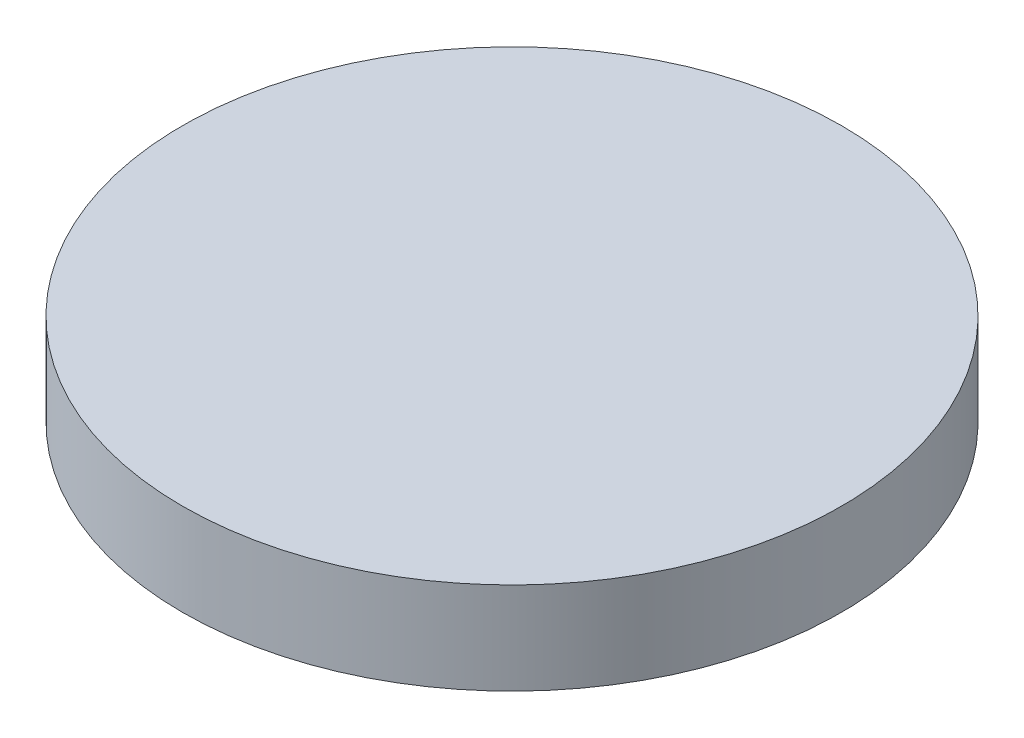
ISO-10303-21;
HEADER;
FILE_DESCRIPTION(('STEP AP214'),'2;1');
FILE_NAME('part.step','',(''),(''),'','','');
FILE_SCHEMA(('AUTOMOTIVE_DESIGN { 1 0 10303 214 1 1 1 1 }'));
ENDSEC;
DATA;
#1=APPLICATION_CONTEXT('core data for automotive mechanical design processes');
#2=APPLICATION_PROTOCOL_DEFINITION('international standard','automotive_design',2000,#1);
#3=PRODUCT_CONTEXT('',#1,'mechanical');
#4=PRODUCT('Part','Part','',(#3));
#5=PRODUCT_RELATED_PRODUCT_CATEGORY('part','',(#4));
#6=PRODUCT_DEFINITION_FORMATION('','',#4);
#7=PRODUCT_DEFINITION_CONTEXT('part definition',#1,'design');
#8=PRODUCT_DEFINITION('design','',#6,#7);
#9=PRODUCT_DEFINITION_SHAPE('','',#8);
#10=(LENGTH_UNIT() NAMED_UNIT(*) SI_UNIT(.MILLI.,.METRE.));
#11=(NAMED_UNIT(*) PLANE_ANGLE_UNIT() SI_UNIT($,.RADIAN.));
#12=(NAMED_UNIT(*) SI_UNIT($,.STERADIAN.) SOLID_ANGLE_UNIT());
#13=UNCERTAINTY_MEASURE_WITH_UNIT(LENGTH_MEASURE(1.E-05),#10,'distance_accuracy_value','');
#14=(GEOMETRIC_REPRESENTATION_CONTEXT(3) GLOBAL_UNCERTAINTY_ASSIGNED_CONTEXT((#13)) GLOBAL_UNIT_ASSIGNED_CONTEXT((#10,
#11,#12)) REPRESENTATION_CONTEXT('',''));
#15=CARTESIAN_POINT('',(0.,0.,0.));
#16=DIRECTION('',(0.,0.,1.));
#17=DIRECTION('',(1.,0.,0.));
#18=AXIS2_PLACEMENT_3D('',#15,#16,#17);
#19=CARTESIAN_POINT('',(0.,7.62,0.));
#20=DIRECTION('',(0.,-1.,0.));
#21=DIRECTION('',(0.,0.,-1.));
#22=AXIS2_PLACEMENT_3D('',#19,#20,#21);
#23=CYLINDRICAL_SURFACE('',#22,27.305);
#24=CARTESIAN_POINT('',(0.,7.62,0.));
#25=DIRECTION('',(0.,1.,0.));
#26=DIRECTION('',(0.,0.,1.));
#27=AXIS2_PLACEMENT_3D('',#24,#25,#26);
#28=CIRCLE('',#27,27.305);
#29=CARTESIAN_POINT('',(0.,7.62,-27.305));
#30=VERTEX_POINT('',#29);
#31=EDGE_CURVE('E10',#30,#30,#28,.T.);
#32=CARTESIAN_POINT('',(0.,0.,0.));
#33=DIRECTION('',(0.,1.,0.));
#34=DIRECTION('',(0.,0.,1.));
#35=AXIS2_PLACEMENT_3D('',#32,#33,#34);
#36=CIRCLE('',#35,27.305);
#37=CARTESIAN_POINT('',(0.,0.,-27.305));
#38=VERTEX_POINT('',#37);
#39=EDGE_CURVE('E40',#38,#38,#36,.T.);
#40=CARTESIAN_POINT('',(0.,7.62,-27.305));
#41=CARTESIAN_POINT('',(0.,7.540625,-27.305));
#42=CARTESIAN_POINT('',(0.,7.46125,-27.305));
#43=CARTESIAN_POINT('',(0.,7.3025,-27.305));
#44=CARTESIAN_POINT('',(0.,7.223125,-27.305));
#45=CARTESIAN_POINT('',(0.,7.064375,-27.305));
#46=CARTESIAN_POINT('',(0.,6.985,-27.305));
#47=CARTESIAN_POINT('',(0.,6.82625,-27.305));
#48=CARTESIAN_POINT('',(0.,6.746875,-27.305));
#49=CARTESIAN_POINT('',(0.,6.588125,-27.305));
#50=CARTESIAN_POINT('',(0.,6.50875,-27.305));
#51=CARTESIAN_POINT('',(0.,6.35,-27.305));
#52=CARTESIAN_POINT('',(0.,6.270625,-27.305));
#53=CARTESIAN_POINT('',(0.,6.111875,-27.305));
#54=CARTESIAN_POINT('',(0.,6.0325,-27.305));
#55=CARTESIAN_POINT('',(0.,5.87375,-27.305));
#56=CARTESIAN_POINT('',(0.,5.794375,-27.305));
#57=CARTESIAN_POINT('',(0.,5.635625,-27.305));
#58=CARTESIAN_POINT('',(0.,5.55625,-27.305));
#59=CARTESIAN_POINT('',(0.,5.3975,-27.305));
#60=CARTESIAN_POINT('',(0.,5.318125,-27.305));
#61=CARTESIAN_POINT('',(0.,5.159375,-27.305));
#62=CARTESIAN_POINT('',(0.,5.08,-27.305));
#63=CARTESIAN_POINT('',(0.,4.92125,-27.305));
#64=CARTESIAN_POINT('',(0.,4.841875,-27.305));
#65=CARTESIAN_POINT('',(0.,4.683125,-27.305));
#66=CARTESIAN_POINT('',(0.,4.60375,-27.305));
#67=CARTESIAN_POINT('',(0.,4.445,-27.305));
#68=CARTESIAN_POINT('',(0.,4.365625,-27.305));
#69=CARTESIAN_POINT('',(0.,4.206875,-27.305));
#70=CARTESIAN_POINT('',(0.,4.1275,-27.305));
#71=CARTESIAN_POINT('',(0.,3.96875,-27.305));
#72=CARTESIAN_POINT('',(0.,3.889375,-27.305));
#73=CARTESIAN_POINT('',(0.,3.730625,-27.305));
#74=CARTESIAN_POINT('',(0.,3.65125,-27.305));
#75=CARTESIAN_POINT('',(0.,3.4925,-27.305));
#76=CARTESIAN_POINT('',(0.,3.413125,-27.305));
#77=CARTESIAN_POINT('',(0.,3.254375,-27.305));
#78=CARTESIAN_POINT('',(0.,3.175,-27.305));
#79=CARTESIAN_POINT('',(0.,3.01625,-27.305));
#80=CARTESIAN_POINT('',(0.,2.936875,-27.305));
#81=CARTESIAN_POINT('',(0.,2.778125,-27.305));
#82=CARTESIAN_POINT('',(0.,2.69875,-27.305));
#83=CARTESIAN_POINT('',(0.,2.54,-27.305));
#84=CARTESIAN_POINT('',(0.,2.460625,-27.305));
#85=CARTESIAN_POINT('',(0.,2.301875,-27.305));
#86=CARTESIAN_POINT('',(0.,2.2225,-27.305));
#87=CARTESIAN_POINT('',(0.,2.06375,-27.305));
#88=CARTESIAN_POINT('',(0.,1.984375,-27.305));
#89=CARTESIAN_POINT('',(0.,1.825625,-27.305));
#90=CARTESIAN_POINT('',(0.,1.74625,-27.305));
#91=CARTESIAN_POINT('',(0.,1.5875,-27.305));
#92=CARTESIAN_POINT('',(0.,1.508125,-27.305));
#93=CARTESIAN_POINT('',(0.,1.349375,-27.305));
#94=CARTESIAN_POINT('',(0.,1.27,-27.305));
#95=CARTESIAN_POINT('',(0.,1.11125,-27.305));
#96=CARTESIAN_POINT('',(0.,1.031875,-27.305));
#97=CARTESIAN_POINT('',(0.,0.873125,-27.305));
#98=CARTESIAN_POINT('',(0.,0.79375,-27.305));
#99=CARTESIAN_POINT('',(0.,0.635,-27.305));
#100=CARTESIAN_POINT('',(0.,0.555625,-27.305));
#101=CARTESIAN_POINT('',(0.,0.396875,-27.305));
#102=CARTESIAN_POINT('',(0.,0.3175,-27.305));
#103=CARTESIAN_POINT('',(0.,0.15875,-27.305));
#104=CARTESIAN_POINT('',(0.,0.0793749999999999,-27.305));
#105=CARTESIAN_POINT('',(0.,0.,-27.305));
#106=B_SPLINE_CURVE_WITH_KNOTS('',3,(#40,#41,#42,#43,#44,#45,#46,#47,#48,#49,#50,#51,#52,#53,
#54,#55,#56,#57,#58,#59,#60,#61,#62,#63,#64,#65,#66,#67,#68,#69,#70,#71,#72,#73,#74,#75,#76,#77,
#78,#79,#80,#81,#82,#83,#84,#85,#86,#87,#88,#89,#90,#91,#92,#93,#94,#95,#96,#97,#98,#99,#100,
#101,#102,#103,#104,#105),.UNSPECIFIED.,.F.,.F.,(4,2,2,2,2,2,2,2,2,2,2,2,2,2,2,2,2,2,2,2,2,2,2,
2,2,2,2,2,2,2,2,2,4),(0.,0.238125,0.476249999999999,0.714375,0.952499999999999,1.190625,1.42875,
1.666875,1.905,2.143125,2.38125,2.619375,2.8575,3.095625,3.33375,3.571875,3.81,4.048125,4.28625,
4.524375,4.7625,5.000625,5.23875,5.476875,5.715,5.953125,6.19125,6.429375,6.6675,6.905625,
7.14375,7.381875,7.62),.UNSPECIFIED.);
#107=EDGE_CURVE('BSEAM37',#30,#38,#106,.T.);
#108=ORIENTED_EDGE('',*,*,#31,.F.);
#109=ORIENTED_EDGE('',*,*,#39,.T.);
#110=ORIENTED_EDGE('',*,*,#107,.T.);
#111=ORIENTED_EDGE('',*,*,#107,.F.);
#112=EDGE_LOOP('',(#108,#110,#109,#111));
#113=FACE_BOUND('',#112,.T.);
#114=ADVANCED_FACE('F37',(#113),#23,.T.);
#115=CARTESIAN_POINT('',(0.,7.62,0.));
#116=DIRECTION('',(0.,1.,0.));
#117=DIRECTION('',(0.,0.,1.));
#118=AXIS2_PLACEMENT_3D('',#115,#116,#117);
#119=PLANE('',#118);
#120=ORIENTED_EDGE('',*,*,#31,.T.);
#121=EDGE_LOOP('',(#120));
#122=FACE_BOUND('',#121,.T.);
#123=ADVANCED_FACE('F54',(#122),#119,.T.);
#124=CARTESIAN_POINT('',(0.,0.,0.));
#125=DIRECTION('',(0.,1.,0.));
#126=DIRECTION('',(0.,0.,1.));
#127=AXIS2_PLACEMENT_3D('',#124,#125,#126);
#128=PLANE('',#127);
#129=ORIENTED_EDGE('',*,*,#39,.F.);
#130=EDGE_LOOP('',(#129));
#131=FACE_BOUND('',#130,.T.);
#132=ADVANCED_FACE('F52',(#131),#128,.F.);
#133=CLOSED_SHELL('',(#114,#123,#132));
#134=MANIFOLD_SOLID_BREP('B2',#133);
#135=ADVANCED_BREP_SHAPE_REPRESENTATION('',(#18,#134),#14);
#136=SHAPE_DEFINITION_REPRESENTATION(#9,#135);
ENDSEC;
END-ISO-10303-21;
